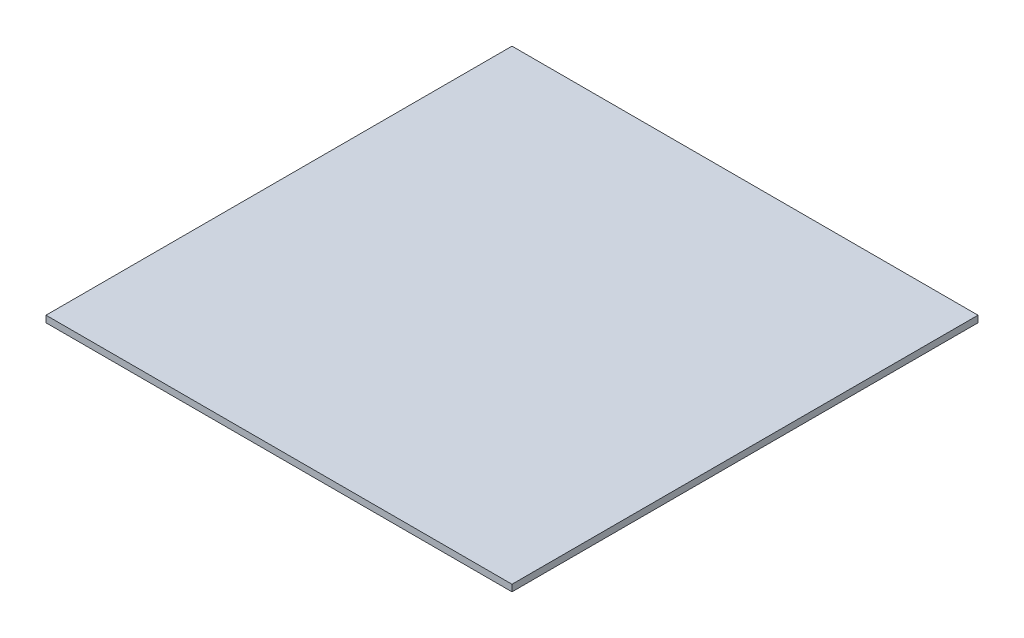
ISO-10303-21;
HEADER;
FILE_DESCRIPTION(('STEP AP214'),'2;1');
FILE_NAME('part.step','',(''),(''),'','','');
FILE_SCHEMA(('AUTOMOTIVE_DESIGN { 1 0 10303 214 1 1 1 1 }'));
ENDSEC;
DATA;
#1=APPLICATION_CONTEXT('core data for automotive mechanical design processes');
#2=APPLICATION_PROTOCOL_DEFINITION('international standard','automotive_design',2000,#1);
#3=PRODUCT_CONTEXT('',#1,'mechanical');
#4=PRODUCT('Part','Part','',(#3));
#5=PRODUCT_RELATED_PRODUCT_CATEGORY('part','',(#4));
#6=PRODUCT_DEFINITION_FORMATION('','',#4);
#7=PRODUCT_DEFINITION_CONTEXT('part definition',#1,'design');
#8=PRODUCT_DEFINITION('design','',#6,#7);
#9=PRODUCT_DEFINITION_SHAPE('','',#8);
#10=(LENGTH_UNIT() NAMED_UNIT(*) SI_UNIT(.MILLI.,.METRE.));
#11=(NAMED_UNIT(*) PLANE_ANGLE_UNIT() SI_UNIT($,.RADIAN.));
#12=(NAMED_UNIT(*) SI_UNIT($,.STERADIAN.) SOLID_ANGLE_UNIT());
#13=UNCERTAINTY_MEASURE_WITH_UNIT(LENGTH_MEASURE(1.E-05),#10,'distance_accuracy_value','');
#14=(GEOMETRIC_REPRESENTATION_CONTEXT(3) GLOBAL_UNCERTAINTY_ASSIGNED_CONTEXT((#13)) GLOBAL_UNIT_ASSIGNED_CONTEXT((#10,
#11,#12)) REPRESENTATION_CONTEXT('',''));
#15=CARTESIAN_POINT('',(0.,0.,0.));
#16=DIRECTION('',(0.,0.,1.));
#17=DIRECTION('',(1.,0.,0.));
#18=AXIS2_PLACEMENT_3D('',#15,#16,#17);
#19=CARTESIAN_POINT('',(50.,0.71,50.));
#20=DIRECTION('',(-1.,0.,0.));
#21=DIRECTION('',(0.,0.,1.));
#22=AXIS2_PLACEMENT_3D('',#19,#20,#21);
#23=PLANE('',#22);
#24=DIRECTION('',(0.,0.,-1.));
#25=VECTOR('',#24,1.);
#26=CARTESIAN_POINT('',(50.,-0.71,50.));
#27=LINE('',#26,#25);
#28=CARTESIAN_POINT('',(50.,-0.71,50.));
#29=VERTEX_POINT('',#28);
#30=CARTESIAN_POINT('',(50.,-0.71,-50.));
#31=VERTEX_POINT('',#30);
#32=EDGE_CURVE('E96',#29,#31,#27,.T.);
#33=ORIENTED_EDGE('',*,*,#32,.T.);
#34=DIRECTION('',(0.,-1.,0.));
#35=VECTOR('',#34,1.);
#36=CARTESIAN_POINT('',(50.,0.71,-50.));
#37=LINE('',#36,#35);
#38=CARTESIAN_POINT('',(50.,0.71,-50.));
#39=VERTEX_POINT('',#38);
#40=EDGE_CURVE('E11',#39,#31,#37,.T.);
#41=ORIENTED_EDGE('',*,*,#40,.F.);
#42=DIRECTION('',(0.,0.,-1.));
#43=VECTOR('',#42,1.);
#44=CARTESIAN_POINT('',(50.,0.71,50.));
#45=LINE('',#44,#43);
#46=CARTESIAN_POINT('',(50.,0.71,50.));
#47=VERTEX_POINT('',#46);
#48=EDGE_CURVE('E84',#47,#39,#45,.T.);
#49=ORIENTED_EDGE('',*,*,#48,.F.);
#50=DIRECTION('',(0.,-1.,0.));
#51=VECTOR('',#50,1.);
#52=CARTESIAN_POINT('',(50.,0.71,50.));
#53=LINE('',#52,#51);
#54=EDGE_CURVE('E92',#47,#29,#53,.T.);
#55=ORIENTED_EDGE('',*,*,#54,.T.);
#56=EDGE_LOOP('',(#33,#41,#49,#55));
#57=FACE_BOUND('',#56,.T.);
#58=ADVANCED_FACE('F33',(#57),#23,.F.);
#59=CARTESIAN_POINT('',(-50.,0.71,-50.));
#60=DIRECTION('',(0.,0.,1.));
#61=DIRECTION('',(1.,0.,0.));
#62=AXIS2_PLACEMENT_3D('',#59,#60,#61);
#63=PLANE('',#62);
#64=DIRECTION('',(-1.,0.,0.));
#65=VECTOR('',#64,1.);
#66=CARTESIAN_POINT('',(-50.,-0.71,-50.));
#67=LINE('',#66,#65);
#68=CARTESIAN_POINT('',(-50.,-0.71,-50.));
#69=VERTEX_POINT('',#68);
#70=EDGE_CURVE('E88',#31,#69,#67,.T.);
#71=ORIENTED_EDGE('',*,*,#70,.T.);
#72=DIRECTION('',(0.,-1.,0.));
#73=VECTOR('',#72,1.);
#74=CARTESIAN_POINT('',(-50.,0.71,-50.));
#75=LINE('',#74,#73);
#76=CARTESIAN_POINT('',(-50.,0.71,-50.));
#77=VERTEX_POINT('',#76);
#78=EDGE_CURVE('E41',#77,#69,#75,.T.);
#79=ORIENTED_EDGE('',*,*,#78,.F.);
#80=DIRECTION('',(-1.,0.,0.));
#81=VECTOR('',#80,1.);
#82=CARTESIAN_POINT('',(-50.,0.71,-50.));
#83=LINE('',#82,#81);
#84=EDGE_CURVE('E79',#39,#77,#83,.T.);
#85=ORIENTED_EDGE('',*,*,#84,.F.);
#86=ORIENTED_EDGE('',*,*,#40,.T.);
#87=EDGE_LOOP('',(#71,#79,#85,#86));
#88=FACE_BOUND('',#87,.T.);
#89=ADVANCED_FACE('F87',(#88),#63,.F.);
#90=CARTESIAN_POINT('',(-50.,0.71,50.));
#91=DIRECTION('',(1.,0.,0.));
#92=DIRECTION('',(0.,0.,-1.));
#93=AXIS2_PLACEMENT_3D('',#90,#91,#92);
#94=PLANE('',#93);
#95=DIRECTION('',(0.,0.,1.));
#96=VECTOR('',#95,1.);
#97=CARTESIAN_POINT('',(-50.,-0.71,50.));
#98=LINE('',#97,#96);
#99=CARTESIAN_POINT('',(-50.,-0.71,50.));
#100=VERTEX_POINT('',#99);
#101=EDGE_CURVE('E66',#69,#100,#98,.T.);
#102=ORIENTED_EDGE('',*,*,#101,.T.);
#103=DIRECTION('',(0.,-1.,0.));
#104=VECTOR('',#103,1.);
#105=CARTESIAN_POINT('',(-50.,0.71,50.));
#106=LINE('',#105,#104);
#107=CARTESIAN_POINT('',(-50.,0.71,50.));
#108=VERTEX_POINT('',#107);
#109=EDGE_CURVE('E89',#108,#100,#106,.T.);
#110=ORIENTED_EDGE('',*,*,#109,.F.);
#111=DIRECTION('',(0.,0.,1.));
#112=VECTOR('',#111,1.);
#113=CARTESIAN_POINT('',(-50.,0.71,50.));
#114=LINE('',#113,#112);
#115=EDGE_CURVE('E82',#77,#108,#114,.T.);
#116=ORIENTED_EDGE('',*,*,#115,.F.);
#117=ORIENTED_EDGE('',*,*,#78,.T.);
#118=EDGE_LOOP('',(#102,#110,#116,#117));
#119=FACE_BOUND('',#118,.T.);
#120=ADVANCED_FACE('F90',(#119),#94,.F.);
#121=CARTESIAN_POINT('',(-50.,0.71,50.));
#122=DIRECTION('',(0.,0.,-1.));
#123=DIRECTION('',(-1.,0.,0.));
#124=AXIS2_PLACEMENT_3D('',#121,#122,#123);
#125=PLANE('',#124);
#126=DIRECTION('',(1.,0.,0.));
#127=VECTOR('',#126,1.);
#128=CARTESIAN_POINT('',(-50.,-0.71,50.));
#129=LINE('',#128,#127);
#130=EDGE_CURVE('E72',#100,#29,#129,.T.);
#131=ORIENTED_EDGE('',*,*,#130,.T.);
#132=ORIENTED_EDGE('',*,*,#54,.F.);
#133=DIRECTION('',(1.,0.,0.));
#134=VECTOR('',#133,1.);
#135=CARTESIAN_POINT('',(-50.,0.71,50.));
#136=LINE('',#135,#134);
#137=EDGE_CURVE('E49',#108,#47,#136,.T.);
#138=ORIENTED_EDGE('',*,*,#137,.F.);
#139=ORIENTED_EDGE('',*,*,#109,.T.);
#140=EDGE_LOOP('',(#131,#132,#138,#139));
#141=FACE_BOUND('',#140,.T.);
#142=ADVANCED_FACE('F103',(#141),#125,.F.);
#143=CARTESIAN_POINT('',(0.,0.71,0.));
#144=DIRECTION('',(0.,-1.,0.));
#145=DIRECTION('',(0.,0.,-1.));
#146=AXIS2_PLACEMENT_3D('',#143,#144,#145);
#147=PLANE('',#146);
#148=ORIENTED_EDGE('',*,*,#48,.T.);
#149=ORIENTED_EDGE('',*,*,#84,.T.);
#150=ORIENTED_EDGE('',*,*,#115,.T.);
#151=ORIENTED_EDGE('',*,*,#137,.T.);
#152=EDGE_LOOP('',(#148,#149,#150,#151));
#153=FACE_BOUND('',#152,.T.);
#154=ADVANCED_FACE('F80',(#153),#147,.F.);
#155=CARTESIAN_POINT('',(0.,-0.71,0.));
#156=DIRECTION('',(0.,-1.,0.));
#157=DIRECTION('',(0.,0.,-1.));
#158=AXIS2_PLACEMENT_3D('',#155,#156,#157);
#159=PLANE('',#158);
#160=ORIENTED_EDGE('',*,*,#32,.F.);
#161=ORIENTED_EDGE('',*,*,#130,.F.);
#162=ORIENTED_EDGE('',*,*,#101,.F.);
#163=ORIENTED_EDGE('',*,*,#70,.F.);
#164=EDGE_LOOP('',(#160,#161,#162,#163));
#165=FACE_BOUND('',#164,.T.);
#166=ADVANCED_FACE('F106',(#165),#159,.T.);
#167=CLOSED_SHELL('',(#58,#89,#120,#142,#154,#166));
#168=MANIFOLD_SOLID_BREP('B2',#167);
#169=ADVANCED_BREP_SHAPE_REPRESENTATION('',(#18,#168),#14);
#170=SHAPE_DEFINITION_REPRESENTATION(#9,#169);
ENDSEC;
END-ISO-10303-21;
